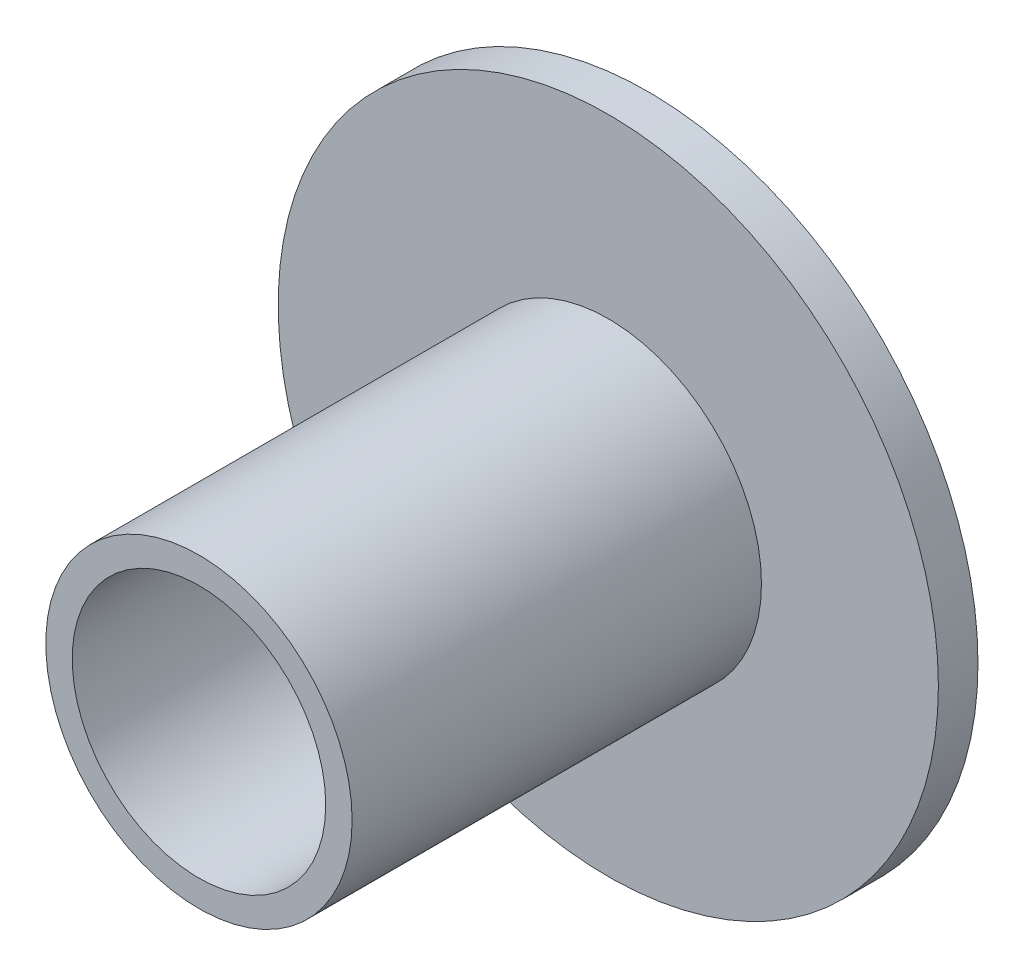
ISO-10303-21;
HEADER;
FILE_DESCRIPTION(('STEP AP214'),'2;1');
FILE_NAME('part.step','',(''),(''),'','','');
FILE_SCHEMA(('AUTOMOTIVE_DESIGN { 1 0 10303 214 1 1 1 1 }'));
ENDSEC;
DATA;
#1=APPLICATION_CONTEXT('core data for automotive mechanical design processes');
#2=APPLICATION_PROTOCOL_DEFINITION('international standard','automotive_design',2000,#1);
#3=PRODUCT_CONTEXT('',#1,'mechanical');
#4=PRODUCT('Part','Part','',(#3));
#5=PRODUCT_RELATED_PRODUCT_CATEGORY('part','',(#4));
#6=PRODUCT_DEFINITION_FORMATION('','',#4);
#7=PRODUCT_DEFINITION_CONTEXT('part definition',#1,'design');
#8=PRODUCT_DEFINITION('design','',#6,#7);
#9=PRODUCT_DEFINITION_SHAPE('','',#8);
#10=(LENGTH_UNIT() NAMED_UNIT(*) SI_UNIT(.MILLI.,.METRE.));
#11=(NAMED_UNIT(*) PLANE_ANGLE_UNIT() SI_UNIT($,.RADIAN.));
#12=(NAMED_UNIT(*) SI_UNIT($,.STERADIAN.) SOLID_ANGLE_UNIT());
#13=UNCERTAINTY_MEASURE_WITH_UNIT(LENGTH_MEASURE(1.E-05),#10,'distance_accuracy_value','');
#14=(GEOMETRIC_REPRESENTATION_CONTEXT(3) GLOBAL_UNCERTAINTY_ASSIGNED_CONTEXT((#13)) GLOBAL_UNIT_ASSIGNED_CONTEXT((#10,
#11,#12)) REPRESENTATION_CONTEXT('',''));
#15=CARTESIAN_POINT('',(0.,0.,0.));
#16=DIRECTION('',(0.,0.,1.));
#17=DIRECTION('',(1.,0.,0.));
#18=AXIS2_PLACEMENT_3D('',#15,#16,#17);
#19=CARTESIAN_POINT('',(0.,0.,-0.381));
#20=DIRECTION('',(0.,0.,1.));
#21=DIRECTION('',(1.,0.,0.));
#22=AXIS2_PLACEMENT_3D('',#19,#20,#21);
#23=CYLINDRICAL_SURFACE('',#22,1.2192);
#24=CARTESIAN_POINT('',(0.,0.,-0.381));
#25=DIRECTION('',(0.,0.,1.));
#26=DIRECTION('',(1.,0.,0.));
#27=AXIS2_PLACEMENT_3D('',#24,#25,#26);
#28=CIRCLE('',#27,1.2192);
#29=CARTESIAN_POINT('',(1.2192,0.,-0.381));
#30=VERTEX_POINT('',#29);
#31=EDGE_CURVE('E43',#30,#30,#28,.T.);
#32=CARTESIAN_POINT('',(0.,0.,3.937));
#33=DIRECTION('',(0.,0.,1.));
#34=DIRECTION('',(1.,0.,0.));
#35=AXIS2_PLACEMENT_3D('',#32,#33,#34);
#36=CIRCLE('',#35,1.2192);
#37=CARTESIAN_POINT('',(1.2192,0.,3.937));
#38=VERTEX_POINT('',#37);
#39=EDGE_CURVE('E52',#38,#38,#36,.T.);
#40=CARTESIAN_POINT('',(1.2192,0.,-0.381));
#41=CARTESIAN_POINT('',(1.2192,0.,-0.336020833333333));
#42=CARTESIAN_POINT('',(1.2192,0.,-0.291041666666667));
#43=CARTESIAN_POINT('',(1.2192,0.,-0.201083333333333));
#44=CARTESIAN_POINT('',(1.2192,0.,-0.156104166666667));
#45=CARTESIAN_POINT('',(1.2192,0.,-0.0661458333333333));
#46=CARTESIAN_POINT('',(1.2192,0.,-0.0211666666666667));
#47=CARTESIAN_POINT('',(1.2192,0.,0.0687916666666667));
#48=CARTESIAN_POINT('',(1.2192,0.,0.113770833333333));
#49=CARTESIAN_POINT('',(1.2192,0.,0.203729166666667));
#50=CARTESIAN_POINT('',(1.2192,0.,0.248708333333333));
#51=CARTESIAN_POINT('',(1.2192,0.,0.338666666666667));
#52=CARTESIAN_POINT('',(1.2192,0.,0.383645833333333));
#53=CARTESIAN_POINT('',(1.2192,0.,0.473604166666667));
#54=CARTESIAN_POINT('',(1.2192,0.,0.518583333333333));
#55=CARTESIAN_POINT('',(1.2192,0.,0.608541666666667));
#56=CARTESIAN_POINT('',(1.2192,0.,0.653520833333333));
#57=CARTESIAN_POINT('',(1.2192,0.,0.743479166666667));
#58=CARTESIAN_POINT('',(1.2192,0.,0.788458333333333));
#59=CARTESIAN_POINT('',(1.2192,0.,0.878416666666667));
#60=CARTESIAN_POINT('',(1.2192,0.,0.923395833333333));
#61=CARTESIAN_POINT('',(1.2192,0.,1.01335416666667));
#62=CARTESIAN_POINT('',(1.2192,0.,1.05833333333333));
#63=CARTESIAN_POINT('',(1.2192,0.,1.14829166666667));
#64=CARTESIAN_POINT('',(1.2192,0.,1.19327083333333));
#65=CARTESIAN_POINT('',(1.2192,0.,1.28322916666667));
#66=CARTESIAN_POINT('',(1.2192,0.,1.32820833333333));
#67=CARTESIAN_POINT('',(1.2192,0.,1.41816666666667));
#68=CARTESIAN_POINT('',(1.2192,0.,1.46314583333333));
#69=CARTESIAN_POINT('',(1.2192,0.,1.55310416666667));
#70=CARTESIAN_POINT('',(1.2192,0.,1.59808333333333));
#71=CARTESIAN_POINT('',(1.2192,0.,1.68804166666667));
#72=CARTESIAN_POINT('',(1.2192,0.,1.73302083333333));
#73=CARTESIAN_POINT('',(1.2192,0.,1.82297916666667));
#74=CARTESIAN_POINT('',(1.2192,0.,1.86795833333333));
#75=CARTESIAN_POINT('',(1.2192,0.,1.95791666666667));
#76=CARTESIAN_POINT('',(1.2192,0.,2.00289583333333));
#77=CARTESIAN_POINT('',(1.2192,0.,2.09285416666667));
#78=CARTESIAN_POINT('',(1.2192,0.,2.13783333333333));
#79=CARTESIAN_POINT('',(1.2192,0.,2.22779166666667));
#80=CARTESIAN_POINT('',(1.2192,0.,2.27277083333333));
#81=CARTESIAN_POINT('',(1.2192,0.,2.36272916666667));
#82=CARTESIAN_POINT('',(1.2192,0.,2.40770833333333));
#83=CARTESIAN_POINT('',(1.2192,0.,2.49766666666667));
#84=CARTESIAN_POINT('',(1.2192,0.,2.54264583333333));
#85=CARTESIAN_POINT('',(1.2192,0.,2.63260416666667));
#86=CARTESIAN_POINT('',(1.2192,0.,2.67758333333333));
#87=CARTESIAN_POINT('',(1.2192,0.,2.76754166666667));
#88=CARTESIAN_POINT('',(1.2192,0.,2.81252083333333));
#89=CARTESIAN_POINT('',(1.2192,0.,2.90247916666667));
#90=CARTESIAN_POINT('',(1.2192,0.,2.94745833333333));
#91=CARTESIAN_POINT('',(1.2192,0.,3.03741666666667));
#92=CARTESIAN_POINT('',(1.2192,0.,3.08239583333333));
#93=CARTESIAN_POINT('',(1.2192,0.,3.17235416666667));
#94=CARTESIAN_POINT('',(1.2192,0.,3.21733333333333));
#95=CARTESIAN_POINT('',(1.2192,0.,3.30729166666667));
#96=CARTESIAN_POINT('',(1.2192,0.,3.35227083333333));
#97=CARTESIAN_POINT('',(1.2192,0.,3.44222916666667));
#98=CARTESIAN_POINT('',(1.2192,0.,3.48720833333333));
#99=CARTESIAN_POINT('',(1.2192,0.,3.57716666666667));
#100=CARTESIAN_POINT('',(1.2192,0.,3.62214583333333));
#101=CARTESIAN_POINT('',(1.2192,0.,3.71210416666667));
#102=CARTESIAN_POINT('',(1.2192,0.,3.75708333333333));
#103=CARTESIAN_POINT('',(1.2192,0.,3.84704166666667));
#104=CARTESIAN_POINT('',(1.2192,0.,3.89202083333333));
#105=CARTESIAN_POINT('',(1.2192,0.,3.937));
#106=B_SPLINE_CURVE_WITH_KNOTS('',3,(#40,#41,#42,#43,#44,#45,#46,#47,#48,#49,#50,#51,#52,#53,
#54,#55,#56,#57,#58,#59,#60,#61,#62,#63,#64,#65,#66,#67,#68,#69,#70,#71,#72,#73,#74,#75,#76,#77,
#78,#79,#80,#81,#82,#83,#84,#85,#86,#87,#88,#89,#90,#91,#92,#93,#94,#95,#96,#97,#98,#99,#100,
#101,#102,#103,#104,#105),.UNSPECIFIED.,.F.,.F.,(4,2,2,2,2,2,2,2,2,2,2,2,2,2,2,2,2,2,2,2,2,2,2,
2,2,2,2,2,2,2,2,2,4),(0.,0.1349375,0.269875,0.4048125,0.53975,0.6746875,0.809625,0.9445625,
1.0795,1.2144375,1.349375,1.4843125,1.61925,1.7541875,1.889125,2.0240625,2.159,2.2939375,
2.428875,2.5638125,2.69875,2.8336875,2.968625,3.1035625,3.2385,3.3734375,3.508375,3.6433125,
3.77825,3.9131875,4.048125,4.1830625,4.318),.UNSPECIFIED.);
#107=EDGE_CURVE('BSEAM36',#30,#38,#106,.T.);
#108=ORIENTED_EDGE('',*,*,#31,.F.);
#109=ORIENTED_EDGE('',*,*,#39,.T.);
#110=ORIENTED_EDGE('',*,*,#107,.T.);
#111=ORIENTED_EDGE('',*,*,#107,.F.);
#112=EDGE_LOOP('',(#108,#110,#109,#111));
#113=FACE_BOUND('',#112,.T.);
#114=ADVANCED_FACE('F36',(#113),#23,.F.);
#115=CARTESIAN_POINT('',(0.,0.,-0.381));
#116=DIRECTION('',(0.,0.,1.));
#117=DIRECTION('',(1.,0.,0.));
#118=AXIS2_PLACEMENT_3D('',#115,#116,#117);
#119=CYLINDRICAL_SURFACE('',#118,3.175);
#120=CARTESIAN_POINT('',(0.,0.,-0.381));
#121=DIRECTION('',(0.,0.,1.));
#122=DIRECTION('',(1.,0.,0.));
#123=AXIS2_PLACEMENT_3D('',#120,#121,#122);
#124=CIRCLE('',#123,3.175);
#125=CARTESIAN_POINT('',(3.175,0.,-0.381));
#126=VERTEX_POINT('',#125);
#127=EDGE_CURVE('E10',#126,#126,#124,.T.);
#128=CARTESIAN_POINT('',(0.,0.,0.));
#129=DIRECTION('',(0.,0.,1.));
#130=DIRECTION('',(1.,0.,0.));
#131=AXIS2_PLACEMENT_3D('',#128,#129,#130);
#132=CIRCLE('',#131,3.175);
#133=CARTESIAN_POINT('',(3.175,0.,0.));
#134=VERTEX_POINT('',#133);
#135=EDGE_CURVE('E39',#134,#134,#132,.T.);
#136=CARTESIAN_POINT('',(3.175,0.,-0.381));
#137=CARTESIAN_POINT('',(3.175,0.,-0.37703125));
#138=CARTESIAN_POINT('',(3.175,0.,-0.3730625));
#139=CARTESIAN_POINT('',(3.175,0.,-0.365125));
#140=CARTESIAN_POINT('',(3.175,0.,-0.36115625));
#141=CARTESIAN_POINT('',(3.175,0.,-0.35321875));
#142=CARTESIAN_POINT('',(3.175,0.,-0.34925));
#143=CARTESIAN_POINT('',(3.175,0.,-0.3413125));
#144=CARTESIAN_POINT('',(3.175,0.,-0.33734375));
#145=CARTESIAN_POINT('',(3.175,0.,-0.32940625));
#146=CARTESIAN_POINT('',(3.175,0.,-0.3254375));
#147=CARTESIAN_POINT('',(3.175,0.,-0.3175));
#148=CARTESIAN_POINT('',(3.175,0.,-0.31353125));
#149=CARTESIAN_POINT('',(3.175,0.,-0.30559375));
#150=CARTESIAN_POINT('',(3.175,0.,-0.301625));
#151=CARTESIAN_POINT('',(3.175,0.,-0.2936875));
#152=CARTESIAN_POINT('',(3.175,0.,-0.28971875));
#153=CARTESIAN_POINT('',(3.175,0.,-0.28178125));
#154=CARTESIAN_POINT('',(3.175,0.,-0.2778125));
#155=CARTESIAN_POINT('',(3.175,0.,-0.269875));
#156=CARTESIAN_POINT('',(3.175,0.,-0.26590625));
#157=CARTESIAN_POINT('',(3.175,0.,-0.25796875));
#158=CARTESIAN_POINT('',(3.175,0.,-0.254));
#159=CARTESIAN_POINT('',(3.175,0.,-0.2460625));
#160=CARTESIAN_POINT('',(3.175,0.,-0.24209375));
#161=CARTESIAN_POINT('',(3.175,0.,-0.23415625));
#162=CARTESIAN_POINT('',(3.175,0.,-0.2301875));
#163=CARTESIAN_POINT('',(3.175,0.,-0.22225));
#164=CARTESIAN_POINT('',(3.175,0.,-0.21828125));
#165=CARTESIAN_POINT('',(3.175,0.,-0.21034375));
#166=CARTESIAN_POINT('',(3.175,0.,-0.206375));
#167=CARTESIAN_POINT('',(3.175,0.,-0.1984375));
#168=CARTESIAN_POINT('',(3.175,0.,-0.19446875));
#169=CARTESIAN_POINT('',(3.175,0.,-0.18653125));
#170=CARTESIAN_POINT('',(3.175,0.,-0.1825625));
#171=CARTESIAN_POINT('',(3.175,0.,-0.174625));
#172=CARTESIAN_POINT('',(3.175,0.,-0.17065625));
#173=CARTESIAN_POINT('',(3.175,0.,-0.16271875));
#174=CARTESIAN_POINT('',(3.175,0.,-0.15875));
#175=CARTESIAN_POINT('',(3.175,0.,-0.1508125));
#176=CARTESIAN_POINT('',(3.175,0.,-0.14684375));
#177=CARTESIAN_POINT('',(3.175,0.,-0.13890625));
#178=CARTESIAN_POINT('',(3.175,0.,-0.1349375));
#179=CARTESIAN_POINT('',(3.175,0.,-0.127));
#180=CARTESIAN_POINT('',(3.175,0.,-0.12303125));
#181=CARTESIAN_POINT('',(3.175,0.,-0.11509375));
#182=CARTESIAN_POINT('',(3.175,0.,-0.111125));
#183=CARTESIAN_POINT('',(3.175,0.,-0.1031875));
#184=CARTESIAN_POINT('',(3.175,0.,-0.09921875));
#185=CARTESIAN_POINT('',(3.175,0.,-0.09128125));
#186=CARTESIAN_POINT('',(3.175,0.,-0.0873125));
#187=CARTESIAN_POINT('',(3.175,0.,-0.079375));
#188=CARTESIAN_POINT('',(3.175,0.,-0.07540625));
#189=CARTESIAN_POINT('',(3.175,0.,-0.06746875));
#190=CARTESIAN_POINT('',(3.175,0.,-0.0635));
#191=CARTESIAN_POINT('',(3.175,0.,-0.0555625));
#192=CARTESIAN_POINT('',(3.175,0.,-0.05159375));
#193=CARTESIAN_POINT('',(3.175,0.,-0.04365625));
#194=CARTESIAN_POINT('',(3.175,0.,-0.0396875));
#195=CARTESIAN_POINT('',(3.175,0.,-0.03175));
#196=CARTESIAN_POINT('',(3.175,0.,-0.02778125));
#197=CARTESIAN_POINT('',(3.175,0.,-0.01984375));
#198=CARTESIAN_POINT('',(3.175,0.,-0.015875));
#199=CARTESIAN_POINT('',(3.175,0.,-0.00793749999999999));
#200=CARTESIAN_POINT('',(3.175,0.,-0.00396874999999999));
#201=CARTESIAN_POINT('',(3.175,0.,0.));
#202=B_SPLINE_CURVE_WITH_KNOTS('',3,(#136,#137,#138,#139,#140,#141,#142,#143,#144,#145,#146,
#147,#148,#149,#150,#151,#152,#153,#154,#155,#156,#157,#158,#159,#160,#161,#162,#163,#164,#165,
#166,#167,#168,#169,#170,#171,#172,#173,#174,#175,#176,#177,#178,#179,#180,#181,#182,#183,#184,
#185,#186,#187,#188,#189,#190,#191,#192,#193,#194,#195,#196,#197,#198,#199,#200,#201),
.UNSPECIFIED.,.F.,.F.,(4,2,2,2,2,2,2,2,2,2,2,2,2,2,2,2,2,2,2,2,2,2,2,2,2,2,2,2,2,2,2,2,4),(0.,
0.01190625,0.0238125,0.03571875,0.047625,0.05953125,0.0714375,0.08334375,0.0952500000000001,
0.10715625,0.1190625,0.13096875,0.142875,0.15478125,0.1666875,0.17859375,0.1905,0.20240625,
0.2143125,0.22621875,0.238125,0.25003125,0.2619375,0.27384375,0.28575,0.29765625,0.3095625,
0.32146875,0.333375,0.34528125,0.3571875,0.36909375,0.381),.UNSPECIFIED.);
#203=EDGE_CURVE('BSEAM80',#126,#134,#202,.T.);
#204=ORIENTED_EDGE('',*,*,#127,.T.);
#205=ORIENTED_EDGE('',*,*,#135,.F.);
#206=ORIENTED_EDGE('',*,*,#203,.T.);
#207=ORIENTED_EDGE('',*,*,#203,.F.);
#208=EDGE_LOOP('',(#204,#206,#205,#207));
#209=FACE_BOUND('',#208,.T.);
#210=ADVANCED_FACE('F80',(#209),#119,.T.);
#211=CARTESIAN_POINT('',(0.,0.,-0.381));
#212=DIRECTION('',(0.,0.,1.));
#213=DIRECTION('',(1.,0.,0.));
#214=AXIS2_PLACEMENT_3D('',#211,#212,#213);
#215=PLANE('',#214);
#216=ORIENTED_EDGE('',*,*,#31,.T.);
#217=EDGE_LOOP('',(#216));
#218=FACE_BOUND('',#217,.T.);
#219=ORIENTED_EDGE('',*,*,#127,.F.);
#220=EDGE_LOOP('',(#219));
#221=FACE_BOUND('',#220,.T.);
#222=ADVANCED_FACE('F75',(#218,#221),#215,.F.);
#223=CARTESIAN_POINT('',(0.,0.,0.));
#224=DIRECTION('',(0.,0.,1.));
#225=DIRECTION('',(1.,0.,0.));
#226=AXIS2_PLACEMENT_3D('',#223,#224,#225);
#227=PLANE('',#226);
#228=CARTESIAN_POINT('',(0.,0.,0.));
#229=DIRECTION('',(0.,0.,1.));
#230=DIRECTION('',(1.,0.,0.));
#231=AXIS2_PLACEMENT_3D('',#228,#229,#230);
#232=CIRCLE('',#231,1.4732);
#233=CARTESIAN_POINT('',(1.4732,0.,0.));
#234=VERTEX_POINT('',#233);
#235=EDGE_CURVE('E49',#234,#234,#232,.T.);
#236=ORIENTED_EDGE('',*,*,#235,.F.);
#237=EDGE_LOOP('',(#236));
#238=FACE_BOUND('',#237,.T.);
#239=ORIENTED_EDGE('',*,*,#135,.T.);
#240=EDGE_LOOP('',(#239));
#241=FACE_BOUND('',#240,.T.);
#242=ADVANCED_FACE('F69',(#238,#241),#227,.T.);
#243=CARTESIAN_POINT('',(0.,0.,3.937));
#244=DIRECTION('',(0.,0.,-1.));
#245=DIRECTION('',(-1.,0.,0.));
#246=AXIS2_PLACEMENT_3D('',#243,#244,#245);
#247=CYLINDRICAL_SURFACE('',#246,1.4732);
#248=CARTESIAN_POINT('',(0.,0.,3.937));
#249=DIRECTION('',(0.,0.,1.));
#250=DIRECTION('',(1.,0.,0.));
#251=AXIS2_PLACEMENT_3D('',#248,#249,#250);
#252=CIRCLE('',#251,1.4732);
#253=CARTESIAN_POINT('',(1.4732,0.,3.937));
#254=VERTEX_POINT('',#253);
#255=EDGE_CURVE('E53',#254,#254,#252,.T.);
#256=ORIENTED_EDGE('',*,*,#255,.F.);
#257=EDGE_LOOP('',(#256));
#258=FACE_BOUND('',#257,.T.);
#259=ORIENTED_EDGE('',*,*,#235,.T.);
#260=EDGE_LOOP('',(#259));
#261=FACE_BOUND('',#260,.T.);
#262=ADVANCED_FACE('F63',(#258,#261),#247,.T.);
#263=CARTESIAN_POINT('',(0.,0.,3.937));
#264=DIRECTION('',(0.,0.,1.));
#265=DIRECTION('',(1.,0.,0.));
#266=AXIS2_PLACEMENT_3D('',#263,#264,#265);
#267=PLANE('',#266);
#268=ORIENTED_EDGE('',*,*,#39,.F.);
#269=EDGE_LOOP('',(#268));
#270=FACE_BOUND('',#269,.T.);
#271=ORIENTED_EDGE('',*,*,#255,.T.);
#272=EDGE_LOOP('',(#271));
#273=FACE_BOUND('',#272,.T.);
#274=ADVANCED_FACE('F60',(#270,#273),#267,.T.);
#275=CLOSED_SHELL('',(#114,#210,#222,#242,#262,#274));
#276=MANIFOLD_SOLID_BREP('B2',#275);
#277=ADVANCED_BREP_SHAPE_REPRESENTATION('',(#18,#276),#14);
#278=SHAPE_DEFINITION_REPRESENTATION(#9,#277);
ENDSEC;
END-ISO-10303-21;
